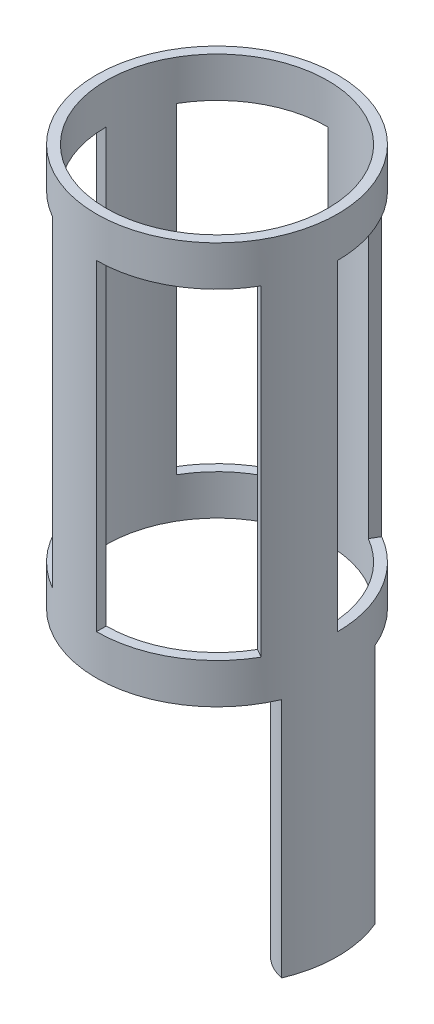
ISO-10303-21;
HEADER;
FILE_DESCRIPTION(('STEP AP214'),'2;1');
FILE_NAME('part.step','',(''),(''),'','','');
FILE_SCHEMA(('AUTOMOTIVE_DESIGN { 1 0 10303 214 1 1 1 1 }'));
ENDSEC;
DATA;
#1=APPLICATION_CONTEXT('core data for automotive mechanical design processes');
#2=APPLICATION_PROTOCOL_DEFINITION('international standard','automotive_design',2000,#1);
#3=PRODUCT_CONTEXT('',#1,'mechanical');
#4=PRODUCT('Part','Part','',(#3));
#5=PRODUCT_RELATED_PRODUCT_CATEGORY('part','',(#4));
#6=PRODUCT_DEFINITION_FORMATION('','',#4);
#7=PRODUCT_DEFINITION_CONTEXT('part definition',#1,'design');
#8=PRODUCT_DEFINITION('design','',#6,#7);
#9=PRODUCT_DEFINITION_SHAPE('','',#8);
#10=(LENGTH_UNIT() NAMED_UNIT(*) SI_UNIT(.MILLI.,.METRE.));
#11=(NAMED_UNIT(*) PLANE_ANGLE_UNIT() SI_UNIT($,.RADIAN.));
#12=(NAMED_UNIT(*) SI_UNIT($,.STERADIAN.) SOLID_ANGLE_UNIT());
#13=UNCERTAINTY_MEASURE_WITH_UNIT(LENGTH_MEASURE(1.E-05),#10,'distance_accuracy_value','');
#14=(GEOMETRIC_REPRESENTATION_CONTEXT(3) GLOBAL_UNCERTAINTY_ASSIGNED_CONTEXT((#13)) GLOBAL_UNIT_ASSIGNED_CONTEXT((#10,
#11,#12)) REPRESENTATION_CONTEXT('',''));
#15=CARTESIAN_POINT('',(0.,0.,0.));
#16=DIRECTION('',(0.,0.,1.));
#17=DIRECTION('',(1.,0.,0.));
#18=AXIS2_PLACEMENT_3D('',#15,#16,#17);
#19=CARTESIAN_POINT('',(0.,0.,0.));
#20=DIRECTION('',(0.,1.,0.));
#21=DIRECTION('',(0.,0.,1.));
#22=AXIS2_PLACEMENT_3D('',#19,#20,#21);
#23=PLANE('',#22);
#24=CARTESIAN_POINT('',(0.,0.,0.));
#25=DIRECTION('',(0.,-1.,0.));
#26=DIRECTION('',(0.,0.,-1.));
#27=AXIS2_PLACEMENT_3D('',#24,#25,#26);
#28=CIRCLE('',#27,35.6);
#29=CARTESIAN_POINT('',(33.109842519685,0.,-13.080455967651));
#30=VERTEX_POINT('',#29);
#31=CARTESIAN_POINT('',(33.109842519685,0.,13.080455967651));
#32=VERTEX_POINT('',#31);
#33=EDGE_CURVE('E55',#30,#32,#28,.T.);
#34=ORIENTED_EDGE('',*,*,#33,.T.);
#35=CARTESIAN_POINT('',(38.1,0.,0.));
#36=DIRECTION('',(0.,-1.,0.));
#37=DIRECTION('',(0.,0.,-1.));
#38=AXIS2_PLACEMENT_3D('',#35,#36,#37);
#39=CIRCLE('',#38,14.);
#40=CARTESIAN_POINT('',(32.553937007874,0.,12.854617275025));
#41=VERTEX_POINT('',#40);
#42=EDGE_CURVE('E48',#32,#41,#39,.T.);
#43=ORIENTED_EDGE('',*,*,#42,.T.);
#44=CARTESIAN_POINT('',(0.,0.,0.));
#45=DIRECTION('',(0.,1.,0.));
#46=DIRECTION('',(0.,0.,1.));
#47=AXIS2_PLACEMENT_3D('',#44,#45,#46);
#48=CIRCLE('',#47,35.);
#49=CARTESIAN_POINT('',(32.553937007874,0.,-12.854617275025));
#50=VERTEX_POINT('',#49);
#51=EDGE_CURVE('E331',#41,#50,#48,.T.);
#52=ORIENTED_EDGE('',*,*,#51,.T.);
#53=EDGE_CURVE('E11',#50,#30,#39,.T.);
#54=ORIENTED_EDGE('',*,*,#53,.T.);
#55=EDGE_LOOP('',(#34,#43,#52,#54));
#56=FACE_BOUND('',#55,.T.);
#57=ADVANCED_FACE('F37',(#56),#23,.F.);
#58=CARTESIAN_POINT('',(0.,127.,0.));
#59=DIRECTION('',(0.866025403784438,0.,0.500000000000001));
#60=DIRECTION('',(0.500000000000001,0.,-0.866025403784438));
#61=AXIS2_PLACEMENT_3D('',#58,#59,#60);
#62=PLANE('',#61);
#63=DIRECTION('',(-0.500000000000001,0.,0.866025403784438));
#64=VECTOR('',#63,1.);
#65=CARTESIAN_POINT('',(0.,114.3,0.));
#66=LINE('',#65,#64);
#67=CARTESIAN_POINT('',(-17.5,114.3,30.3108891324553));
#68=VERTEX_POINT('',#67);
#69=CARTESIAN_POINT('',(-19.0500000000001,114.3,32.9955678841871));
#70=VERTEX_POINT('',#69);
#71=EDGE_CURVE('E251',#68,#70,#66,.T.);
#72=ORIENTED_EDGE('',*,*,#71,.F.);
#73=DIRECTION('',(0.,-1.,0.));
#74=VECTOR('',#73,1.);
#75=CARTESIAN_POINT('',(-17.5,127.,30.3108891324553));
#76=LINE('',#75,#74);
#77=CARTESIAN_POINT('',(-17.5,12.7,30.3108891324553));
#78=VERTEX_POINT('',#77);
#79=EDGE_CURVE('E308',#68,#78,#76,.T.);
#80=ORIENTED_EDGE('',*,*,#79,.T.);
#81=DIRECTION('',(0.500000000000001,0.,-0.866025403784438));
#82=VECTOR('',#81,1.);
#83=CARTESIAN_POINT('',(0.,12.7,0.));
#84=LINE('',#83,#82);
#85=CARTESIAN_POINT('',(-19.0500000000001,12.7,32.9955678841871));
#86=VERTEX_POINT('',#85);
#87=EDGE_CURVE('E313',#86,#78,#84,.T.);
#88=ORIENTED_EDGE('',*,*,#87,.F.);
#89=DIRECTION('',(0.,-1.,0.));
#90=VECTOR('',#89,1.);
#91=CARTESIAN_POINT('',(-19.0500000000001,127.,32.9955678841871));
#92=LINE('',#91,#90);
#93=EDGE_CURVE('E306',#70,#86,#92,.T.);
#94=ORIENTED_EDGE('',*,*,#93,.F.);
#95=EDGE_LOOP('',(#72,#80,#88,#94));
#96=FACE_BOUND('',#95,.T.);
#97=ADVANCED_FACE('F369',(#96),#62,.F.);
#98=CARTESIAN_POINT('',(0.,127.,0.));
#99=DIRECTION('',(-1.,0.,0.));
#100=DIRECTION('',(0.,0.,1.));
#101=AXIS2_PLACEMENT_3D('',#98,#99,#100);
#102=PLANE('',#101);
#103=DIRECTION('',(0.,0.,-1.));
#104=VECTOR('',#103,1.);
#105=CARTESIAN_POINT('',(0.,114.3,0.));
#106=LINE('',#105,#104);
#107=CARTESIAN_POINT('',(0.,114.3,38.1));
#108=VERTEX_POINT('',#107);
#109=CARTESIAN_POINT('',(0.,114.3,35.));
#110=VERTEX_POINT('',#109);
#111=EDGE_CURVE('E248',#108,#110,#106,.T.);
#112=ORIENTED_EDGE('',*,*,#111,.F.);
#113=DIRECTION('',(0.,-1.,0.));
#114=VECTOR('',#113,1.);
#115=CARTESIAN_POINT('',(0.,127.,38.1));
#116=LINE('',#115,#114);
#117=CARTESIAN_POINT('',(0.,12.7,38.1));
#118=VERTEX_POINT('',#117);
#119=EDGE_CURVE('E304',#108,#118,#116,.T.);
#120=ORIENTED_EDGE('',*,*,#119,.T.);
#121=DIRECTION('',(0.,0.,1.));
#122=VECTOR('',#121,1.);
#123=CARTESIAN_POINT('',(0.,12.7,0.));
#124=LINE('',#123,#122);
#125=CARTESIAN_POINT('',(0.,12.7,35.));
#126=VERTEX_POINT('',#125);
#127=EDGE_CURVE('E310',#126,#118,#124,.T.);
#128=ORIENTED_EDGE('',*,*,#127,.F.);
#129=DIRECTION('',(0.,-1.,0.));
#130=VECTOR('',#129,1.);
#131=CARTESIAN_POINT('',(0.,127.,35.));
#132=LINE('',#131,#130);
#133=EDGE_CURVE('E302',#110,#126,#132,.T.);
#134=ORIENTED_EDGE('',*,*,#133,.F.);
#135=EDGE_LOOP('',(#112,#120,#128,#134));
#136=FACE_BOUND('',#135,.T.);
#137=ADVANCED_FACE('F429',(#136),#102,.F.);
#138=CARTESIAN_POINT('',(0.,127.,0.));
#139=DIRECTION('',(0.500000000000003,0.,-0.866025403784437));
#140=DIRECTION('',(-0.866025403784437,0.,-0.500000000000003));
#141=AXIS2_PLACEMENT_3D('',#138,#139,#140);
#142=PLANE('',#141);
#143=DIRECTION('',(0.866025403784437,0.,0.500000000000003));
#144=VECTOR('',#143,1.);
#145=CARTESIAN_POINT('',(0.,114.3,0.));
#146=LINE('',#145,#144);
#147=CARTESIAN_POINT('',(30.3108891324553,114.3,17.5));
#148=VERTEX_POINT('',#147);
#149=CARTESIAN_POINT('',(32.9955678841871,114.3,19.05));
#150=VERTEX_POINT('',#149);
#151=EDGE_CURVE('E245',#148,#150,#146,.T.);
#152=ORIENTED_EDGE('',*,*,#151,.F.);
#153=DIRECTION('',(0.,-1.,0.));
#154=VECTOR('',#153,1.);
#155=CARTESIAN_POINT('',(30.3108891324553,127.,17.5));
#156=LINE('',#155,#154);
#157=CARTESIAN_POINT('',(30.3108891324553,12.7,17.5));
#158=VERTEX_POINT('',#157);
#159=EDGE_CURVE('E288',#148,#158,#156,.T.);
#160=ORIENTED_EDGE('',*,*,#159,.T.);
#161=DIRECTION('',(-0.866025403784437,0.,-0.500000000000003));
#162=VECTOR('',#161,1.);
#163=CARTESIAN_POINT('',(0.,12.7,0.));
#164=LINE('',#163,#162);
#165=CARTESIAN_POINT('',(32.9955678841871,12.7,19.05));
#166=VERTEX_POINT('',#165);
#167=EDGE_CURVE('E293',#166,#158,#164,.T.);
#168=ORIENTED_EDGE('',*,*,#167,.F.);
#169=DIRECTION('',(0.,-1.,0.));
#170=VECTOR('',#169,1.);
#171=CARTESIAN_POINT('',(32.9955678841871,127.,19.05));
#172=LINE('',#171,#170);
#173=EDGE_CURVE('E286',#150,#166,#172,.T.);
#174=ORIENTED_EDGE('',*,*,#173,.F.);
#175=EDGE_LOOP('',(#152,#160,#168,#174));
#176=FACE_BOUND('',#175,.T.);
#177=ADVANCED_FACE('F470',(#176),#142,.F.);
#178=CARTESIAN_POINT('',(0.,127.,0.));
#179=DIRECTION('',(0.,0.,-1.));
#180=DIRECTION('',(-1.,0.,0.));
#181=AXIS2_PLACEMENT_3D('',#178,#179,#180);
#182=PLANE('',#181);
#183=DIRECTION('',(0.,-1.,0.));
#184=VECTOR('',#183,1.);
#185=CARTESIAN_POINT('',(35.,127.,0.));
#186=LINE('',#185,#184);
#187=CARTESIAN_POINT('',(35.,114.3,0.));
#188=VERTEX_POINT('',#187);
#189=CARTESIAN_POINT('',(35.,12.7,0.));
#190=VERTEX_POINT('',#189);
#191=EDGE_CURVE('E282',#188,#190,#186,.T.);
#192=ORIENTED_EDGE('',*,*,#191,.F.);
#193=DIRECTION('',(1.,0.,0.));
#194=VECTOR('',#193,1.);
#195=CARTESIAN_POINT('',(0.,114.3,0.));
#196=LINE('',#195,#194);
#197=CARTESIAN_POINT('',(38.1,114.3,0.));
#198=VERTEX_POINT('',#197);
#199=EDGE_CURVE('E242',#188,#198,#196,.T.);
#200=ORIENTED_EDGE('',*,*,#199,.T.);
#201=DIRECTION('',(0.,-1.,0.));
#202=VECTOR('',#201,1.);
#203=CARTESIAN_POINT('',(38.1,127.,0.));
#204=LINE('',#203,#202);
#205=CARTESIAN_POINT('',(38.1,12.7,0.));
#206=VERTEX_POINT('',#205);
#207=EDGE_CURVE('E284',#198,#206,#204,.T.);
#208=ORIENTED_EDGE('',*,*,#207,.T.);
#209=DIRECTION('',(-1.,0.,0.));
#210=VECTOR('',#209,1.);
#211=CARTESIAN_POINT('',(0.,12.7,0.));
#212=LINE('',#211,#210);
#213=EDGE_CURVE('E290',#206,#190,#212,.T.);
#214=ORIENTED_EDGE('',*,*,#213,.T.);
#215=EDGE_LOOP('',(#192,#200,#208,#214));
#216=FACE_BOUND('',#215,.T.);
#217=ADVANCED_FACE('F390',(#216),#182,.T.);
#218=CARTESIAN_POINT('',(0.,127.,0.));
#219=DIRECTION('',(-0.866025403784438,0.,-0.5));
#220=DIRECTION('',(-0.5,0.,0.866025403784438));
#221=AXIS2_PLACEMENT_3D('',#218,#219,#220);
#222=PLANE('',#221);
#223=DIRECTION('',(0.5,0.,-0.866025403784438));
#224=VECTOR('',#223,1.);
#225=CARTESIAN_POINT('',(0.,114.3,0.));
#226=LINE('',#225,#224);
#227=CARTESIAN_POINT('',(17.5,114.3,-30.3108891324554));
#228=VERTEX_POINT('',#227);
#229=CARTESIAN_POINT('',(19.05,114.3,-32.9955678841871));
#230=VERTEX_POINT('',#229);
#231=EDGE_CURVE('E239',#228,#230,#226,.T.);
#232=ORIENTED_EDGE('',*,*,#231,.F.);
#233=DIRECTION('',(0.,-1.,0.));
#234=VECTOR('',#233,1.);
#235=CARTESIAN_POINT('',(17.5,127.,-30.3108891324554));
#236=LINE('',#235,#234);
#237=CARTESIAN_POINT('',(17.5,12.7,-30.3108891324554));
#238=VERTEX_POINT('',#237);
#239=EDGE_CURVE('E274',#228,#238,#236,.T.);
#240=ORIENTED_EDGE('',*,*,#239,.T.);
#241=DIRECTION('',(-0.5,0.,0.866025403784438));
#242=VECTOR('',#241,1.);
#243=CARTESIAN_POINT('',(0.,12.7,0.));
#244=LINE('',#243,#242);
#245=CARTESIAN_POINT('',(19.05,12.7,-32.9955678841871));
#246=VERTEX_POINT('',#245);
#247=EDGE_CURVE('E279',#246,#238,#244,.T.);
#248=ORIENTED_EDGE('',*,*,#247,.F.);
#249=DIRECTION('',(0.,-1.,0.));
#250=VECTOR('',#249,1.);
#251=CARTESIAN_POINT('',(19.05,127.,-32.9955678841871));
#252=LINE('',#251,#250);
#253=EDGE_CURVE('E272',#230,#246,#252,.T.);
#254=ORIENTED_EDGE('',*,*,#253,.F.);
#255=EDGE_LOOP('',(#232,#240,#248,#254));
#256=FACE_BOUND('',#255,.T.);
#257=ADVANCED_FACE('F464',(#256),#222,.F.);
#258=CARTESIAN_POINT('',(0.,127.,0.));
#259=DIRECTION('',(-1.,0.,0.));
#260=DIRECTION('',(0.,0.,1.));
#261=AXIS2_PLACEMENT_3D('',#258,#259,#260);
#262=PLANE('',#261);
#263=DIRECTION('',(0.,-1.,0.));
#264=VECTOR('',#263,1.);
#265=CARTESIAN_POINT('',(0.,127.,-35.));
#266=LINE('',#265,#264);
#267=CARTESIAN_POINT('',(0.,114.3,-35.));
#268=VERTEX_POINT('',#267);
#269=CARTESIAN_POINT('',(0.,12.7,-35.));
#270=VERTEX_POINT('',#269);
#271=EDGE_CURVE('E268',#268,#270,#266,.T.);
#272=ORIENTED_EDGE('',*,*,#271,.F.);
#273=DIRECTION('',(0.,0.,-1.));
#274=VECTOR('',#273,1.);
#275=CARTESIAN_POINT('',(0.,114.3,0.));
#276=LINE('',#275,#274);
#277=CARTESIAN_POINT('',(0.,114.3,-38.1));
#278=VERTEX_POINT('',#277);
#279=EDGE_CURVE('E236',#268,#278,#276,.T.);
#280=ORIENTED_EDGE('',*,*,#279,.T.);
#281=DIRECTION('',(0.,-1.,0.));
#282=VECTOR('',#281,1.);
#283=CARTESIAN_POINT('',(0.,127.,-38.1));
#284=LINE('',#283,#282);
#285=CARTESIAN_POINT('',(0.,12.7,-38.1));
#286=VERTEX_POINT('',#285);
#287=EDGE_CURVE('E270',#278,#286,#284,.T.);
#288=ORIENTED_EDGE('',*,*,#287,.T.);
#289=DIRECTION('',(0.,0.,1.));
#290=VECTOR('',#289,1.);
#291=CARTESIAN_POINT('',(0.,12.7,0.));
#292=LINE('',#291,#290);
#293=EDGE_CURVE('E276',#286,#270,#292,.T.);
#294=ORIENTED_EDGE('',*,*,#293,.T.);
#295=EDGE_LOOP('',(#272,#280,#288,#294));
#296=FACE_BOUND('',#295,.T.);
#297=ADVANCED_FACE('F415',(#296),#262,.T.);
#298=CARTESIAN_POINT('',(0.,127.,0.));
#299=DIRECTION('',(-0.5,0.,0.866025403784438));
#300=DIRECTION('',(0.866025403784438,0.,0.5));
#301=AXIS2_PLACEMENT_3D('',#298,#299,#300);
#302=PLANE('',#301);
#303=DIRECTION('',(-0.866025403784438,0.,-0.5));
#304=VECTOR('',#303,1.);
#305=CARTESIAN_POINT('',(0.,114.3,0.));
#306=LINE('',#305,#304);
#307=CARTESIAN_POINT('',(-30.3108891324553,114.3,-17.5));
#308=VERTEX_POINT('',#307);
#309=CARTESIAN_POINT('',(-32.9955678841871,114.3,-19.05));
#310=VERTEX_POINT('',#309);
#311=EDGE_CURVE('E232',#308,#310,#306,.T.);
#312=ORIENTED_EDGE('',*,*,#311,.F.);
#313=DIRECTION('',(0.,-1.,0.));
#314=VECTOR('',#313,1.);
#315=CARTESIAN_POINT('',(-30.3108891324553,127.,-17.5));
#316=LINE('',#315,#314);
#317=CARTESIAN_POINT('',(-30.3108891324553,12.7,-17.5));
#318=VERTEX_POINT('',#317);
#319=EDGE_CURVE('E260',#308,#318,#316,.T.);
#320=ORIENTED_EDGE('',*,*,#319,.T.);
#321=DIRECTION('',(0.866025403784438,0.,0.5));
#322=VECTOR('',#321,1.);
#323=CARTESIAN_POINT('',(0.,12.7,0.));
#324=LINE('',#323,#322);
#325=CARTESIAN_POINT('',(-32.9955678841871,12.7,-19.05));
#326=VERTEX_POINT('',#325);
#327=EDGE_CURVE('E265',#326,#318,#324,.T.);
#328=ORIENTED_EDGE('',*,*,#327,.F.);
#329=DIRECTION('',(0.,-1.,0.));
#330=VECTOR('',#329,1.);
#331=CARTESIAN_POINT('',(-32.9955678841871,127.,-19.05));
#332=LINE('',#331,#330);
#333=EDGE_CURVE('E258',#310,#326,#332,.T.);
#334=ORIENTED_EDGE('',*,*,#333,.F.);
#335=EDGE_LOOP('',(#312,#320,#328,#334));
#336=FACE_BOUND('',#335,.T.);
#337=ADVANCED_FACE('F405',(#336),#302,.F.);
#338=CARTESIAN_POINT('',(0.,127.,0.));
#339=DIRECTION('',(0.,0.,1.));
#340=DIRECTION('',(1.,0.,0.));
#341=AXIS2_PLACEMENT_3D('',#338,#339,#340);
#342=PLANE('',#341);
#343=DIRECTION('',(0.,-1.,0.));
#344=VECTOR('',#343,1.);
#345=CARTESIAN_POINT('',(-35.,127.,0.));
#346=LINE('',#345,#344);
#347=CARTESIAN_POINT('',(-35.,114.3,0.));
#348=VERTEX_POINT('',#347);
#349=CARTESIAN_POINT('',(-35.,12.7,0.));
#350=VERTEX_POINT('',#349);
#351=EDGE_CURVE('E254',#348,#350,#346,.T.);
#352=ORIENTED_EDGE('',*,*,#351,.F.);
#353=DIRECTION('',(-1.,0.,0.));
#354=VECTOR('',#353,1.);
#355=CARTESIAN_POINT('',(0.,114.3,0.));
#356=LINE('',#355,#354);
#357=CARTESIAN_POINT('',(-38.1,114.3,0.));
#358=VERTEX_POINT('',#357);
#359=EDGE_CURVE('E41',#348,#358,#356,.T.);
#360=ORIENTED_EDGE('',*,*,#359,.T.);
#361=DIRECTION('',(0.,-1.,0.));
#362=VECTOR('',#361,1.);
#363=CARTESIAN_POINT('',(-38.1,127.,0.));
#364=LINE('',#363,#362);
#365=CARTESIAN_POINT('',(-38.1,12.7,0.));
#366=VERTEX_POINT('',#365);
#367=EDGE_CURVE('E256',#358,#366,#364,.T.);
#368=ORIENTED_EDGE('',*,*,#367,.T.);
#369=DIRECTION('',(1.,0.,0.));
#370=VECTOR('',#369,1.);
#371=CARTESIAN_POINT('',(0.,12.7,0.));
#372=LINE('',#371,#370);
#373=EDGE_CURVE('E262',#366,#350,#372,.T.);
#374=ORIENTED_EDGE('',*,*,#373,.T.);
#375=EDGE_LOOP('',(#352,#360,#368,#374));
#376=FACE_BOUND('',#375,.T.);
#377=ADVANCED_FACE('F355',(#376),#342,.T.);
#378=CARTESIAN_POINT('',(0.,12.7,0.));
#379=DIRECTION('',(0.,1.,0.));
#380=DIRECTION('',(0.,0.,1.));
#381=AXIS2_PLACEMENT_3D('',#378,#379,#380);
#382=PLANE('',#381);
#383=CARTESIAN_POINT('',(0.,12.7,0.));
#384=DIRECTION('',(0.,1.,0.));
#385=DIRECTION('',(0.,0.,1.));
#386=AXIS2_PLACEMENT_3D('',#383,#384,#385);
#387=CIRCLE('',#386,38.1);
#388=EDGE_CURVE('E337',#286,#326,#387,.T.);
#389=ORIENTED_EDGE('',*,*,#388,.T.);
#390=ORIENTED_EDGE('',*,*,#327,.T.);
#391=CARTESIAN_POINT('',(0.,12.7,0.));
#392=DIRECTION('',(0.,1.,0.));
#393=DIRECTION('',(0.,0.,1.));
#394=AXIS2_PLACEMENT_3D('',#391,#392,#393);
#395=CIRCLE('',#394,35.);
#396=EDGE_CURVE('E374',#270,#318,#395,.T.);
#397=ORIENTED_EDGE('',*,*,#396,.F.);
#398=ORIENTED_EDGE('',*,*,#293,.F.);
#399=EDGE_LOOP('',(#389,#390,#397,#398));
#400=FACE_BOUND('',#399,.T.);
#401=ADVANCED_FACE('F401',(#400),#382,.T.);
#402=EDGE_CURVE('E321',#206,#246,#387,.T.);
#403=ORIENTED_EDGE('',*,*,#402,.T.);
#404=ORIENTED_EDGE('',*,*,#247,.T.);
#405=EDGE_CURVE('E326',#190,#238,#395,.T.);
#406=ORIENTED_EDGE('',*,*,#405,.F.);
#407=ORIENTED_EDGE('',*,*,#213,.F.);
#408=EDGE_LOOP('',(#403,#404,#406,#407));
#409=FACE_BOUND('',#408,.T.);
#410=ADVANCED_FACE('F386',(#409),#382,.T.);
#411=EDGE_CURVE('E317',#118,#166,#387,.T.);
#412=ORIENTED_EDGE('',*,*,#411,.T.);
#413=ORIENTED_EDGE('',*,*,#167,.T.);
#414=EDGE_CURVE('E323',#126,#158,#395,.T.);
#415=ORIENTED_EDGE('',*,*,#414,.F.);
#416=ORIENTED_EDGE('',*,*,#127,.T.);
#417=EDGE_LOOP('',(#412,#413,#415,#416));
#418=FACE_BOUND('',#417,.T.);
#419=ADVANCED_FACE('F422',(#418),#382,.T.);
#420=ORIENTED_EDGE('',*,*,#373,.F.);
#421=EDGE_CURVE('E322',#366,#86,#387,.T.);
#422=ORIENTED_EDGE('',*,*,#421,.T.);
#423=ORIENTED_EDGE('',*,*,#87,.T.);
#424=EDGE_CURVE('E320',#350,#78,#395,.T.);
#425=ORIENTED_EDGE('',*,*,#424,.F.);
#426=EDGE_LOOP('',(#420,#422,#423,#425));
#427=FACE_BOUND('',#426,.T.);
#428=ADVANCED_FACE('F365',(#427),#382,.T.);
#429=CARTESIAN_POINT('',(0.,12.7,0.));
#430=DIRECTION('',(0.,-1.,0.));
#431=DIRECTION('',(0.,0.,-1.));
#432=AXIS2_PLACEMENT_3D('',#429,#430,#431);
#433=CYLINDRICAL_SURFACE('',#432,38.1);
#434=ORIENTED_EDGE('',*,*,#207,.F.);
#435=CARTESIAN_POINT('',(0.,114.3,0.));
#436=DIRECTION('',(0.,1.,0.));
#437=DIRECTION('',(0.,0.,1.));
#438=AXIS2_PLACEMENT_3D('',#435,#436,#437);
#439=CIRCLE('',#438,38.1);
#440=EDGE_CURVE('E233',#198,#230,#439,.T.);
#441=ORIENTED_EDGE('',*,*,#440,.T.);
#442=ORIENTED_EDGE('',*,*,#253,.T.);
#443=ORIENTED_EDGE('',*,*,#402,.F.);
#444=EDGE_LOOP('',(#434,#441,#442,#443));
#445=FACE_BOUND('',#444,.T.);
#446=ORIENTED_EDGE('',*,*,#287,.F.);
#447=EDGE_CURVE('E413',#278,#310,#439,.T.);
#448=ORIENTED_EDGE('',*,*,#447,.T.);
#449=ORIENTED_EDGE('',*,*,#333,.T.);
#450=ORIENTED_EDGE('',*,*,#388,.F.);
#451=EDGE_LOOP('',(#446,#448,#449,#450));
#452=FACE_BOUND('',#451,.T.);
#453=ORIENTED_EDGE('',*,*,#367,.F.);
#454=EDGE_CURVE('E227',#358,#70,#439,.T.);
#455=ORIENTED_EDGE('',*,*,#454,.T.);
#456=ORIENTED_EDGE('',*,*,#93,.T.);
#457=ORIENTED_EDGE('',*,*,#421,.F.);
#458=EDGE_LOOP('',(#453,#455,#456,#457));
#459=FACE_BOUND('',#458,.T.);
#460=EDGE_CURVE('E229',#108,#150,#439,.T.);
#461=ORIENTED_EDGE('',*,*,#460,.T.);
#462=ORIENTED_EDGE('',*,*,#173,.T.);
#463=ORIENTED_EDGE('',*,*,#411,.F.);
#464=ORIENTED_EDGE('',*,*,#119,.F.);
#465=EDGE_LOOP('',(#461,#462,#463,#464));
#466=FACE_BOUND('',#465,.T.);
#467=CARTESIAN_POINT('',(0.,127.,0.));
#468=DIRECTION('',(0.,1.,0.));
#469=DIRECTION('',(0.,0.,1.));
#470=AXIS2_PLACEMENT_3D('',#467,#468,#469);
#471=CIRCLE('',#470,38.1);
#472=CARTESIAN_POINT('',(0.,127.,38.1));
#473=VERTEX_POINT('',#472);
#474=EDGE_CURVE('E299',#473,#473,#471,.T.);
#475=ORIENTED_EDGE('',*,*,#474,.F.);
#476=EDGE_LOOP('',(#475));
#477=FACE_BOUND('',#476,.T.);
#478=CARTESIAN_POINT('',(0.,0.,0.));
#479=DIRECTION('',(0.,1.,0.));
#480=DIRECTION('',(0.,0.,1.));
#481=AXIS2_PLACEMENT_3D('',#478,#479,#480);
#482=CIRCLE('',#481,38.1);
#483=CARTESIAN_POINT('',(35.1472440944882,0.,-14.7065030704945));
#484=VERTEX_POINT('',#483);
#485=CARTESIAN_POINT('',(35.1472440944882,0.,14.7065030704945));
#486=VERTEX_POINT('',#485);
#487=EDGE_CURVE('E316',#484,#486,#482,.T.);
#488=ORIENTED_EDGE('',*,*,#487,.T.);
#489=DIRECTION('',(0.,1.,0.));
#490=VECTOR('',#489,1.);
#491=CARTESIAN_POINT('',(35.1472440944882,-76.2,14.7065030704945));
#492=LINE('',#491,#490);
#493=CARTESIAN_POINT('',(35.1472440944882,-76.2,14.7065030704945));
#494=VERTEX_POINT('',#493);
#495=EDGE_CURVE('E219',#494,#486,#492,.T.);
#496=ORIENTED_EDGE('',*,*,#495,.F.);
#497=CARTESIAN_POINT('',(0.,-76.2,0.));
#498=DIRECTION('',(0.,-1.,0.));
#499=DIRECTION('',(0.,0.,-1.));
#500=AXIS2_PLACEMENT_3D('',#497,#498,#499);
#501=CIRCLE('',#500,38.1);
#502=CARTESIAN_POINT('',(35.1472440944882,-76.2,-14.7065030704945));
#503=VERTEX_POINT('',#502);
#504=EDGE_CURVE('E206',#503,#494,#501,.T.);
#505=ORIENTED_EDGE('',*,*,#504,.F.);
#506=DIRECTION('',(0.,1.,0.));
#507=VECTOR('',#506,1.);
#508=CARTESIAN_POINT('',(35.1472440944882,-76.2,-14.7065030704945));
#509=LINE('',#508,#507);
#510=EDGE_CURVE('E196',#503,#484,#509,.T.);
#511=ORIENTED_EDGE('',*,*,#510,.T.);
#512=EDGE_LOOP('',(#488,#496,#505,#511));
#513=FACE_BOUND('',#512,.T.);
#514=ADVANCED_FACE('F39',(#445,#452,#459,#466,#477,#513),#433,.T.);
#515=CARTESIAN_POINT('',(0.,12.7,0.));
#516=DIRECTION('',(0.,-1.,0.));
#517=DIRECTION('',(0.,0.,-1.));
#518=AXIS2_PLACEMENT_3D('',#515,#516,#517);
#519=CYLINDRICAL_SURFACE('',#518,35.);
#520=CARTESIAN_POINT('',(0.,114.3,0.));
#521=DIRECTION('',(0.,1.,0.));
#522=DIRECTION('',(0.,0.,1.));
#523=AXIS2_PLACEMENT_3D('',#520,#521,#522);
#524=CIRCLE('',#523,35.);
#525=EDGE_CURVE('E228',#188,#228,#524,.T.);
#526=ORIENTED_EDGE('',*,*,#525,.F.);
#527=ORIENTED_EDGE('',*,*,#191,.T.);
#528=ORIENTED_EDGE('',*,*,#405,.T.);
#529=ORIENTED_EDGE('',*,*,#239,.F.);
#530=EDGE_LOOP('',(#526,#527,#528,#529));
#531=FACE_BOUND('',#530,.T.);
#532=EDGE_CURVE('E407',#268,#308,#524,.T.);
#533=ORIENTED_EDGE('',*,*,#532,.F.);
#534=ORIENTED_EDGE('',*,*,#271,.T.);
#535=ORIENTED_EDGE('',*,*,#396,.T.);
#536=ORIENTED_EDGE('',*,*,#319,.F.);
#537=EDGE_LOOP('',(#533,#534,#535,#536));
#538=FACE_BOUND('',#537,.T.);
#539=EDGE_CURVE('E222',#348,#68,#524,.T.);
#540=ORIENTED_EDGE('',*,*,#539,.F.);
#541=ORIENTED_EDGE('',*,*,#351,.T.);
#542=ORIENTED_EDGE('',*,*,#424,.T.);
#543=ORIENTED_EDGE('',*,*,#79,.F.);
#544=EDGE_LOOP('',(#540,#541,#542,#543));
#545=FACE_BOUND('',#544,.T.);
#546=EDGE_CURVE('E224',#110,#148,#524,.T.);
#547=ORIENTED_EDGE('',*,*,#546,.F.);
#548=ORIENTED_EDGE('',*,*,#133,.T.);
#549=ORIENTED_EDGE('',*,*,#414,.T.);
#550=ORIENTED_EDGE('',*,*,#159,.F.);
#551=EDGE_LOOP('',(#547,#548,#549,#550));
#552=FACE_BOUND('',#551,.T.);
#553=CARTESIAN_POINT('',(0.,127.,0.));
#554=DIRECTION('',(0.,1.,0.));
#555=DIRECTION('',(0.,0.,1.));
#556=AXIS2_PLACEMENT_3D('',#553,#554,#555);
#557=CIRCLE('',#556,35.);
#558=CARTESIAN_POINT('',(0.,127.,35.));
#559=VERTEX_POINT('',#558);
#560=EDGE_CURVE('E296',#559,#559,#557,.T.);
#561=ORIENTED_EDGE('',*,*,#560,.T.);
#562=EDGE_LOOP('',(#561));
#563=FACE_BOUND('',#562,.T.);
#564=CARTESIAN_POINT('',(32.1733595800525,0.,13.7795113604454));
#565=VERTEX_POINT('',#564);
#566=EDGE_CURVE('E329',#565,#41,#48,.T.);
#567=ORIENTED_EDGE('',*,*,#566,.F.);
#568=CARTESIAN_POINT('',(32.1733595800525,0.,-13.7795113604454));
#569=VERTEX_POINT('',#568);
#570=EDGE_CURVE('E328',#569,#565,#48,.T.);
#571=ORIENTED_EDGE('',*,*,#570,.F.);
#572=EDGE_CURVE('E338',#50,#569,#48,.T.);
#573=ORIENTED_EDGE('',*,*,#572,.F.);
#574=ORIENTED_EDGE('',*,*,#51,.F.);
#575=EDGE_LOOP('',(#567,#571,#573,#574));
#576=FACE_BOUND('',#575,.T.);
#577=ADVANCED_FACE('F372',(#531,#538,#545,#552,#563,#576),#519,.F.);
#578=CARTESIAN_POINT('',(38.1,0.,0.));
#579=DIRECTION('',(0.,-1.,0.));
#580=DIRECTION('',(0.,0.,-1.));
#581=AXIS2_PLACEMENT_3D('',#578,#579,#580);
#582=CIRCLE('',#581,15.);
#583=EDGE_CURVE('E203',#486,#565,#582,.T.);
#584=ORIENTED_EDGE('',*,*,#583,.F.);
#585=ORIENTED_EDGE('',*,*,#487,.F.);
#586=EDGE_CURVE('E46',#569,#484,#582,.T.);
#587=ORIENTED_EDGE('',*,*,#586,.F.);
#588=ORIENTED_EDGE('',*,*,#570,.T.);
#589=EDGE_LOOP('',(#584,#585,#587,#588));
#590=FACE_BOUND('',#589,.T.);
#591=ADVANCED_FACE('F421',(#590),#23,.F.);
#592=CARTESIAN_POINT('',(0.,127.,0.));
#593=DIRECTION('',(0.,1.,0.));
#594=DIRECTION('',(0.,0.,1.));
#595=AXIS2_PLACEMENT_3D('',#592,#593,#594);
#596=PLANE('',#595);
#597=ORIENTED_EDGE('',*,*,#474,.T.);
#598=EDGE_LOOP('',(#597));
#599=FACE_BOUND('',#598,.T.);
#600=ORIENTED_EDGE('',*,*,#560,.F.);
#601=EDGE_LOOP('',(#600));
#602=FACE_BOUND('',#601,.T.);
#603=ADVANCED_FACE('F432',(#599,#602),#596,.T.);
#604=CARTESIAN_POINT('',(0.,114.3,0.));
#605=DIRECTION('',(0.,1.,0.));
#606=DIRECTION('',(0.,0.,1.));
#607=AXIS2_PLACEMENT_3D('',#604,#605,#606);
#608=PLANE('',#607);
#609=ORIENTED_EDGE('',*,*,#539,.T.);
#610=ORIENTED_EDGE('',*,*,#71,.T.);
#611=ORIENTED_EDGE('',*,*,#454,.F.);
#612=ORIENTED_EDGE('',*,*,#359,.F.);
#613=EDGE_LOOP('',(#609,#610,#611,#612));
#614=FACE_BOUND('',#613,.T.);
#615=ADVANCED_FACE('F436',(#614),#608,.F.);
#616=ORIENTED_EDGE('',*,*,#279,.F.);
#617=ORIENTED_EDGE('',*,*,#532,.T.);
#618=ORIENTED_EDGE('',*,*,#311,.T.);
#619=ORIENTED_EDGE('',*,*,#447,.F.);
#620=EDGE_LOOP('',(#616,#617,#618,#619));
#621=FACE_BOUND('',#620,.T.);
#622=ADVANCED_FACE('F411',(#621),#608,.F.);
#623=ORIENTED_EDGE('',*,*,#199,.F.);
#624=ORIENTED_EDGE('',*,*,#525,.T.);
#625=ORIENTED_EDGE('',*,*,#231,.T.);
#626=ORIENTED_EDGE('',*,*,#440,.F.);
#627=EDGE_LOOP('',(#623,#624,#625,#626));
#628=FACE_BOUND('',#627,.T.);
#629=ADVANCED_FACE('F491',(#628),#608,.F.);
#630=ORIENTED_EDGE('',*,*,#460,.F.);
#631=ORIENTED_EDGE('',*,*,#111,.T.);
#632=ORIENTED_EDGE('',*,*,#546,.T.);
#633=ORIENTED_EDGE('',*,*,#151,.T.);
#634=EDGE_LOOP('',(#630,#631,#632,#633));
#635=FACE_BOUND('',#634,.T.);
#636=ADVANCED_FACE('F450',(#635),#608,.F.);
#637=CARTESIAN_POINT('',(0.,0.,0.));
#638=DIRECTION('',(0.,-1.,0.));
#639=DIRECTION('',(0.,0.,-1.));
#640=AXIS2_PLACEMENT_3D('',#637,#638,#639);
#641=PLANE('',#640);
#642=EDGE_CURVE('E214',#565,#569,#582,.T.);
#643=ORIENTED_EDGE('',*,*,#642,.F.);
#644=ORIENTED_EDGE('',*,*,#566,.T.);
#645=EDGE_CURVE('E49',#41,#50,#39,.T.);
#646=ORIENTED_EDGE('',*,*,#645,.T.);
#647=ORIENTED_EDGE('',*,*,#572,.T.);
#648=EDGE_LOOP('',(#643,#644,#646,#647));
#649=FACE_BOUND('',#648,.T.);
#650=ADVANCED_FACE('F343',(#649),#641,.F.);
#651=CARTESIAN_POINT('',(38.1,-76.2,0.));
#652=DIRECTION('',(0.,1.,0.));
#653=DIRECTION('',(0.,0.,1.));
#654=AXIS2_PLACEMENT_3D('',#651,#652,#653);
#655=CYLINDRICAL_SURFACE('',#654,14.);
#656=ORIENTED_EDGE('',*,*,#42,.F.);
#657=DIRECTION('',(0.,1.,0.));
#658=VECTOR('',#657,1.);
#659=CARTESIAN_POINT('',(33.109842519685,-76.2,13.080455967651));
#660=LINE('',#659,#658);
#661=CARTESIAN_POINT('',(33.109842519685,-76.2,13.080455967651));
#662=VERTEX_POINT('',#661);
#663=EDGE_CURVE('E188',#662,#32,#660,.T.);
#664=ORIENTED_EDGE('',*,*,#663,.F.);
#665=CARTESIAN_POINT('',(38.1,-76.2,0.));
#666=DIRECTION('',(0.,-1.,0.));
#667=DIRECTION('',(0.,0.,-1.));
#668=AXIS2_PLACEMENT_3D('',#665,#666,#667);
#669=CIRCLE('',#668,14.);
#670=CARTESIAN_POINT('',(33.109842519685,-76.2,-13.080455967651));
#671=VERTEX_POINT('',#670);
#672=EDGE_CURVE('E191',#662,#671,#669,.T.);
#673=ORIENTED_EDGE('',*,*,#672,.T.);
#674=DIRECTION('',(0.,1.,0.));
#675=VECTOR('',#674,1.);
#676=CARTESIAN_POINT('',(33.109842519685,-76.2,-13.080455967651));
#677=LINE('',#676,#675);
#678=EDGE_CURVE('E197',#671,#30,#677,.T.);
#679=ORIENTED_EDGE('',*,*,#678,.T.);
#680=ORIENTED_EDGE('',*,*,#53,.F.);
#681=ORIENTED_EDGE('',*,*,#645,.F.);
#682=EDGE_LOOP('',(#656,#664,#673,#679,#680,#681));
#683=FACE_BOUND('',#682,.T.);
#684=ADVANCED_FACE('F190',(#683),#655,.F.);
#685=CARTESIAN_POINT('',(0.,-76.2,0.));
#686=DIRECTION('',(0.,1.,0.));
#687=DIRECTION('',(0.,0.,1.));
#688=AXIS2_PLACEMENT_3D('',#685,#686,#687);
#689=CYLINDRICAL_SURFACE('',#688,35.6);
#690=ORIENTED_EDGE('',*,*,#33,.F.);
#691=ORIENTED_EDGE('',*,*,#678,.F.);
#692=CARTESIAN_POINT('',(0.,-76.2,0.));
#693=DIRECTION('',(0.,-1.,0.));
#694=DIRECTION('',(0.,0.,-1.));
#695=AXIS2_PLACEMENT_3D('',#692,#693,#694);
#696=CIRCLE('',#695,35.6);
#697=EDGE_CURVE('E202',#671,#662,#696,.T.);
#698=ORIENTED_EDGE('',*,*,#697,.T.);
#699=ORIENTED_EDGE('',*,*,#663,.T.);
#700=EDGE_LOOP('',(#690,#691,#698,#699));
#701=FACE_BOUND('',#700,.T.);
#702=ADVANCED_FACE('F205',(#701),#689,.F.);
#703=CARTESIAN_POINT('',(38.1,-76.2,0.));
#704=DIRECTION('',(0.,1.,0.));
#705=DIRECTION('',(0.,0.,1.));
#706=AXIS2_PLACEMENT_3D('',#703,#704,#705);
#707=CYLINDRICAL_SURFACE('',#706,15.);
#708=ORIENTED_EDGE('',*,*,#583,.T.);
#709=ORIENTED_EDGE('',*,*,#642,.T.);
#710=ORIENTED_EDGE('',*,*,#586,.T.);
#711=ORIENTED_EDGE('',*,*,#510,.F.);
#712=CARTESIAN_POINT('',(38.1,-76.2,0.));
#713=DIRECTION('',(0.,-1.,0.));
#714=DIRECTION('',(0.,0.,-1.));
#715=AXIS2_PLACEMENT_3D('',#712,#713,#714);
#716=CIRCLE('',#715,15.);
#717=EDGE_CURVE('E209',#494,#503,#716,.T.);
#718=ORIENTED_EDGE('',*,*,#717,.F.);
#719=ORIENTED_EDGE('',*,*,#495,.T.);
#720=EDGE_LOOP('',(#708,#709,#710,#711,#718,#719));
#721=FACE_BOUND('',#720,.T.);
#722=ADVANCED_FACE('F348',(#721),#707,.T.);
#723=CARTESIAN_POINT('',(0.,-76.2,0.));
#724=DIRECTION('',(0.,-1.,0.));
#725=DIRECTION('',(0.,0.,-1.));
#726=AXIS2_PLACEMENT_3D('',#723,#724,#725);
#727=PLANE('',#726);
#728=ORIENTED_EDGE('',*,*,#672,.F.);
#729=ORIENTED_EDGE('',*,*,#697,.F.);
#730=EDGE_LOOP('',(#728,#729));
#731=FACE_BOUND('',#730,.T.);
#732=ORIENTED_EDGE('',*,*,#504,.T.);
#733=ORIENTED_EDGE('',*,*,#717,.T.);
#734=EDGE_LOOP('',(#732,#733));
#735=FACE_BOUND('',#734,.T.);
#736=ADVANCED_FACE('F200',(#731,#735),#727,.T.);
#737=CLOSED_SHELL('',(#57,#97,#137,#177,#217,#257,#297,#337,#377,#401,#410,#419,#428,#514,#577,
#591,#603,#615,#622,#629,#636,#650,#684,#702,#722,#736));
#738=MANIFOLD_SOLID_BREP('B2',#737);
#739=ADVANCED_BREP_SHAPE_REPRESENTATION('',(#18,#738),#14);
#740=SHAPE_DEFINITION_REPRESENTATION(#9,#739);
ENDSEC;
END-ISO-10303-21;
